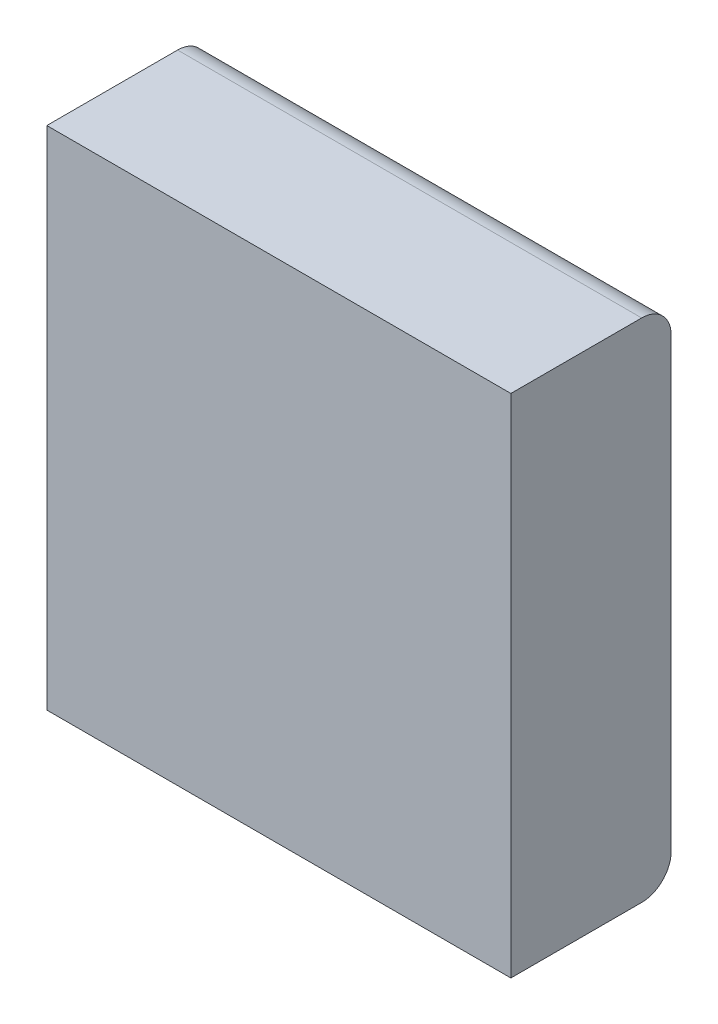
ISO-10303-21;
HEADER;
FILE_DESCRIPTION(('STEP AP214'),'2;1');
FILE_NAME('part.step','',(''),(''),'','','');
FILE_SCHEMA(('AUTOMOTIVE_DESIGN { 1 0 10303 214 1 1 1 1 }'));
ENDSEC;
DATA;
#1=APPLICATION_CONTEXT('core data for automotive mechanical design processes');
#2=APPLICATION_PROTOCOL_DEFINITION('international standard','automotive_design',2000,#1);
#3=PRODUCT_CONTEXT('',#1,'mechanical');
#4=PRODUCT('Part','Part','',(#3));
#5=PRODUCT_RELATED_PRODUCT_CATEGORY('part','',(#4));
#6=PRODUCT_DEFINITION_FORMATION('','',#4);
#7=PRODUCT_DEFINITION_CONTEXT('part definition',#1,'design');
#8=PRODUCT_DEFINITION('design','',#6,#7);
#9=PRODUCT_DEFINITION_SHAPE('','',#8);
#10=(LENGTH_UNIT() NAMED_UNIT(*) SI_UNIT(.MILLI.,.METRE.));
#11=(NAMED_UNIT(*) PLANE_ANGLE_UNIT() SI_UNIT($,.RADIAN.));
#12=(NAMED_UNIT(*) SI_UNIT($,.STERADIAN.) SOLID_ANGLE_UNIT());
#13=UNCERTAINTY_MEASURE_WITH_UNIT(LENGTH_MEASURE(1.E-05),#10,'distance_accuracy_value','');
#14=(GEOMETRIC_REPRESENTATION_CONTEXT(3) GLOBAL_UNCERTAINTY_ASSIGNED_CONTEXT((#13)) GLOBAL_UNIT_ASSIGNED_CONTEXT((#10,
#11,#12)) REPRESENTATION_CONTEXT('',''));
#15=CARTESIAN_POINT('',(0.,0.,0.));
#16=DIRECTION('',(0.,0.,1.));
#17=DIRECTION('',(1.,0.,0.));
#18=AXIS2_PLACEMENT_3D('',#15,#16,#17);
#19=CARTESIAN_POINT('',(-64.0530234910643,35.1607142857143,30.));
#20=DIRECTION('',(1.,0.,0.));
#21=DIRECTION('',(0.,1.,0.));
#22=AXIS2_PLACEMENT_3D('',#19,#20,#21);
#23=PLANE('',#22);
#24=DIRECTION('',(0.,0.,-1.));
#25=VECTOR('',#24,1.);
#26=CARTESIAN_POINT('',(-64.0530234910643,35.1607142857143,30.));
#27=LINE('',#26,#25);
#28=CARTESIAN_POINT('',(-64.0530234910643,35.1607142857143,30.));
#29=VERTEX_POINT('',#28);
#30=CARTESIAN_POINT('',(-64.0530234910644,35.1607142857143,-0.999999999999951));
#31=VERTEX_POINT('',#30);
#32=EDGE_CURVE('E182',#29,#31,#27,.T.);
#33=ORIENTED_EDGE('',*,*,#32,.T.);
#34=CARTESIAN_POINT('',(-64.0530234910644,28.1607142857143,-1.));
#35=DIRECTION('',(1.,0.,0.));
#36=DIRECTION('',(0.,-1.,0.));
#37=AXIS2_PLACEMENT_3D('',#34,#35,#36);
#38=CIRCLE('',#37,7.);
#39=CARTESIAN_POINT('',(-64.0530234910644,28.1607142857142,-8.));
#40=VERTEX_POINT('',#39);
#41=EDGE_CURVE('E155',#40,#31,#38,.T.);
#42=ORIENTED_EDGE('',*,*,#41,.F.);
#43=DIRECTION('',(0.,1.,0.));
#44=VECTOR('',#43,1.);
#45=CARTESIAN_POINT('',(-64.0530234910644,28.1607142857142,-8.));
#46=LINE('',#45,#44);
#47=CARTESIAN_POINT('',(-64.0530234910644,-77.8392857142857,-8.00000000000001));
#48=VERTEX_POINT('',#47);
#49=EDGE_CURVE('E151',#48,#40,#46,.T.);
#50=ORIENTED_EDGE('',*,*,#49,.F.);
#51=CARTESIAN_POINT('',(-64.0530234910644,-77.8392857142857,-1.00000000000001));
#52=DIRECTION('',(1.,0.,0.));
#53=DIRECTION('',(0.,1.,0.));
#54=AXIS2_PLACEMENT_3D('',#51,#52,#53);
#55=CIRCLE('',#54,7.);
#56=CARTESIAN_POINT('',(-64.0530234910644,-84.8392857142857,-0.999999999999966));
#57=VERTEX_POINT('',#56);
#58=EDGE_CURVE('E148',#57,#48,#55,.T.);
#59=ORIENTED_EDGE('',*,*,#58,.F.);
#60=DIRECTION('',(0.,0.,-1.));
#61=VECTOR('',#60,1.);
#62=CARTESIAN_POINT('',(-64.0530234910643,-84.8392857142857,30.));
#63=LINE('',#62,#61);
#64=CARTESIAN_POINT('',(-64.0530234910643,-84.8392857142857,30.));
#65=VERTEX_POINT('',#64);
#66=EDGE_CURVE('E11',#65,#57,#63,.T.);
#67=ORIENTED_EDGE('',*,*,#66,.F.);
#68=DIRECTION('',(0.,-1.,0.));
#69=VECTOR('',#68,1.);
#70=CARTESIAN_POINT('',(-64.0530234910643,35.1607142857143,30.));
#71=LINE('',#70,#69);
#72=EDGE_CURVE('E169',#29,#65,#71,.T.);
#73=ORIENTED_EDGE('',*,*,#72,.F.);
#74=EDGE_LOOP('',(#33,#42,#50,#59,#67,#73));
#75=FACE_BOUND('',#74,.T.);
#76=ADVANCED_FACE('F33',(#75),#23,.F.);
#77=CARTESIAN_POINT('',(-64.0530234910643,-84.8392857142857,30.));
#78=DIRECTION('',(0.,1.,0.));
#79=DIRECTION('',(0.,0.,1.));
#80=AXIS2_PLACEMENT_3D('',#77,#78,#79);
#81=PLANE('',#80);
#82=ORIENTED_EDGE('',*,*,#66,.T.);
#83=DIRECTION('',(1.,0.,0.));
#84=VECTOR('',#83,1.);
#85=CARTESIAN_POINT('',(-64.0530234910644,-84.8392857142857,-0.999999999999966));
#86=LINE('',#85,#84);
#87=CARTESIAN_POINT('',(45.9469765089357,-84.8392857142857,-0.999999999999966));
#88=VERTEX_POINT('',#87);
#89=EDGE_CURVE('E158',#57,#88,#86,.T.);
#90=ORIENTED_EDGE('',*,*,#89,.T.);
#91=DIRECTION('',(0.,0.,-1.));
#92=VECTOR('',#91,1.);
#93=CARTESIAN_POINT('',(45.9469765089357,-84.8392857142857,30.));
#94=LINE('',#93,#92);
#95=CARTESIAN_POINT('',(45.9469765089357,-84.8392857142857,30.));
#96=VERTEX_POINT('',#95);
#97=EDGE_CURVE('E40',#96,#88,#94,.T.);
#98=ORIENTED_EDGE('',*,*,#97,.F.);
#99=DIRECTION('',(1.,0.,0.));
#100=VECTOR('',#99,1.);
#101=CARTESIAN_POINT('',(-64.0530234910643,-84.8392857142857,30.));
#102=LINE('',#101,#100);
#103=EDGE_CURVE('E177',#65,#96,#102,.T.);
#104=ORIENTED_EDGE('',*,*,#103,.F.);
#105=EDGE_LOOP('',(#82,#90,#98,#104));
#106=FACE_BOUND('',#105,.T.);
#107=ADVANCED_FACE('F193',(#106),#81,.F.);
#108=CARTESIAN_POINT('',(45.9469765089356,35.1607142857143,30.));
#109=DIRECTION('',(-1.,0.,0.));
#110=DIRECTION('',(0.,-1.,0.));
#111=AXIS2_PLACEMENT_3D('',#108,#109,#110);
#112=PLANE('',#111);
#113=ORIENTED_EDGE('',*,*,#97,.T.);
#114=CARTESIAN_POINT('',(45.9469765089357,-77.8392857142857,-1.00000000000001));
#115=DIRECTION('',(1.,0.,0.));
#116=DIRECTION('',(0.,1.,0.));
#117=AXIS2_PLACEMENT_3D('',#114,#115,#116);
#118=CIRCLE('',#117,7.);
#119=CARTESIAN_POINT('',(45.9469765089357,-77.8392857142857,-8.00000000000001));
#120=VERTEX_POINT('',#119);
#121=EDGE_CURVE('E144',#88,#120,#118,.T.);
#122=ORIENTED_EDGE('',*,*,#121,.T.);
#123=DIRECTION('',(0.,1.,0.));
#124=VECTOR('',#123,1.);
#125=CARTESIAN_POINT('',(45.9469765089356,28.1607142857142,-8.));
#126=LINE('',#125,#124);
#127=CARTESIAN_POINT('',(45.9469765089356,28.1607142857142,-8.));
#128=VERTEX_POINT('',#127);
#129=EDGE_CURVE('E161',#120,#128,#126,.T.);
#130=ORIENTED_EDGE('',*,*,#129,.T.);
#131=CARTESIAN_POINT('',(45.9469765089356,28.1607142857143,-1.));
#132=DIRECTION('',(1.,0.,0.));
#133=DIRECTION('',(0.,-1.,0.));
#134=AXIS2_PLACEMENT_3D('',#131,#132,#133);
#135=CIRCLE('',#134,7.);
#136=CARTESIAN_POINT('',(45.9469765089356,35.1607142857143,-0.999999999999951));
#137=VERTEX_POINT('',#136);
#138=EDGE_CURVE('E152',#128,#137,#135,.T.);
#139=ORIENTED_EDGE('',*,*,#138,.T.);
#140=DIRECTION('',(0.,0.,-1.));
#141=VECTOR('',#140,1.);
#142=CARTESIAN_POINT('',(45.9469765089356,35.1607142857143,30.));
#143=LINE('',#142,#141);
#144=CARTESIAN_POINT('',(45.9469765089356,35.1607142857143,30.));
#145=VERTEX_POINT('',#144);
#146=EDGE_CURVE('E184',#145,#137,#143,.T.);
#147=ORIENTED_EDGE('',*,*,#146,.F.);
#148=DIRECTION('',(0.,1.,0.));
#149=VECTOR('',#148,1.);
#150=CARTESIAN_POINT('',(45.9469765089356,35.1607142857143,30.));
#151=LINE('',#150,#149);
#152=EDGE_CURVE('E179',#96,#145,#151,.T.);
#153=ORIENTED_EDGE('',*,*,#152,.F.);
#154=EDGE_LOOP('',(#113,#122,#130,#139,#147,#153));
#155=FACE_BOUND('',#154,.T.);
#156=ADVANCED_FACE('F188',(#155),#112,.F.);
#157=CARTESIAN_POINT('',(-64.0530234910643,35.1607142857143,30.));
#158=DIRECTION('',(0.,-1.,0.));
#159=DIRECTION('',(0.,0.,-1.));
#160=AXIS2_PLACEMENT_3D('',#157,#158,#159);
#161=PLANE('',#160);
#162=ORIENTED_EDGE('',*,*,#146,.T.);
#163=DIRECTION('',(1.,0.,0.));
#164=VECTOR('',#163,1.);
#165=CARTESIAN_POINT('',(-64.0530234910644,35.1607142857143,-0.999999999999951));
#166=LINE('',#165,#164);
#167=EDGE_CURVE('E166',#31,#137,#166,.T.);
#168=ORIENTED_EDGE('',*,*,#167,.F.);
#169=ORIENTED_EDGE('',*,*,#32,.F.);
#170=DIRECTION('',(-1.,0.,0.));
#171=VECTOR('',#170,1.);
#172=CARTESIAN_POINT('',(-64.0530234910643,35.1607142857143,30.));
#173=LINE('',#172,#171);
#174=EDGE_CURVE('E55',#145,#29,#173,.T.);
#175=ORIENTED_EDGE('',*,*,#174,.F.);
#176=EDGE_LOOP('',(#162,#168,#169,#175));
#177=FACE_BOUND('',#176,.T.);
#178=ADVANCED_FACE('F208',(#177),#161,.F.);
#179=CARTESIAN_POINT('',(0.,0.,30.));
#180=DIRECTION('',(0.,0.,1.));
#181=DIRECTION('',(1.,0.,0.));
#182=AXIS2_PLACEMENT_3D('',#179,#180,#181);
#183=PLANE('',#182);
#184=ORIENTED_EDGE('',*,*,#72,.T.);
#185=ORIENTED_EDGE('',*,*,#103,.T.);
#186=ORIENTED_EDGE('',*,*,#152,.T.);
#187=ORIENTED_EDGE('',*,*,#174,.T.);
#188=EDGE_LOOP('',(#184,#185,#186,#187));
#189=FACE_BOUND('',#188,.T.);
#190=ADVANCED_FACE('F211',(#189),#183,.T.);
#191=CARTESIAN_POINT('',(-64.0530234910644,28.1607142857143,-1.));
#192=DIRECTION('',(1.,0.,0.));
#193=DIRECTION('',(0.,1.,0.));
#194=AXIS2_PLACEMENT_3D('',#191,#192,#193);
#195=CYLINDRICAL_SURFACE('',#194,7.);
#196=ORIENTED_EDGE('',*,*,#138,.F.);
#197=DIRECTION('',(1.,0.,0.));
#198=VECTOR('',#197,1.);
#199=CARTESIAN_POINT('',(-64.0530234910644,28.1607142857142,-8.));
#200=LINE('',#199,#198);
#201=EDGE_CURVE('E170',#40,#128,#200,.T.);
#202=ORIENTED_EDGE('',*,*,#201,.F.);
#203=ORIENTED_EDGE('',*,*,#41,.T.);
#204=ORIENTED_EDGE('',*,*,#167,.T.);
#205=EDGE_LOOP('',(#196,#202,#203,#204));
#206=FACE_BOUND('',#205,.T.);
#207=ADVANCED_FACE('F204',(#206),#195,.T.);
#208=CARTESIAN_POINT('',(-64.0530234910644,28.1607142857142,-8.));
#209=DIRECTION('',(0.,0.,-1.));
#210=DIRECTION('',(0.,1.,0.));
#211=AXIS2_PLACEMENT_3D('',#208,#209,#210);
#212=PLANE('',#211);
#213=DIRECTION('',(0.,-1.,0.));
#214=VECTOR('',#213,1.);
#215=CARTESIAN_POINT('',(35.9469765089357,-54.8392857142857,-8.00000000000001));
#216=LINE('',#215,#214);
#217=CARTESIAN_POINT('',(35.9469765089357,5.16071428571427,-8.));
#218=VERTEX_POINT('',#217);
#219=CARTESIAN_POINT('',(35.9469765089357,-54.8392857142857,-8.00000000000001));
#220=VERTEX_POINT('',#219);
#221=EDGE_CURVE('E47',#218,#220,#216,.T.);
#222=ORIENTED_EDGE('',*,*,#221,.F.);
#223=DIRECTION('',(1.,0.,0.));
#224=VECTOR('',#223,1.);
#225=CARTESIAN_POINT('',(35.9469765089357,5.16071428571427,-8.));
#226=LINE('',#225,#224);
#227=CARTESIAN_POINT('',(-4.05302349106434,5.16071428571427,-8.));
#228=VERTEX_POINT('',#227);
#229=EDGE_CURVE('E129',#228,#218,#226,.T.);
#230=ORIENTED_EDGE('',*,*,#229,.F.);
#231=DIRECTION('',(0.,1.,0.));
#232=VECTOR('',#231,1.);
#233=CARTESIAN_POINT('',(-4.05302349106434,-54.8392857142857,-8.00000000000001));
#234=LINE('',#233,#232);
#235=CARTESIAN_POINT('',(-4.05302349106434,-54.8392857142857,-8.00000000000001));
#236=VERTEX_POINT('',#235);
#237=EDGE_CURVE('E132',#236,#228,#234,.T.);
#238=ORIENTED_EDGE('',*,*,#237,.F.);
#239=DIRECTION('',(-1.,0.,0.));
#240=VECTOR('',#239,1.);
#241=CARTESIAN_POINT('',(35.9469765089357,-54.8392857142857,-8.00000000000001));
#242=LINE('',#241,#240);
#243=EDGE_CURVE('E138',#220,#236,#242,.T.);
#244=ORIENTED_EDGE('',*,*,#243,.F.);
#245=EDGE_LOOP('',(#222,#230,#238,#244));
#246=FACE_BOUND('',#245,.T.);
#247=ORIENTED_EDGE('',*,*,#129,.F.);
#248=DIRECTION('',(1.,0.,0.));
#249=VECTOR('',#248,1.);
#250=CARTESIAN_POINT('',(-64.0530234910644,-77.8392857142857,-8.00000000000001));
#251=LINE('',#250,#249);
#252=EDGE_CURVE('E172',#48,#120,#251,.T.);
#253=ORIENTED_EDGE('',*,*,#252,.F.);
#254=ORIENTED_EDGE('',*,*,#49,.T.);
#255=ORIENTED_EDGE('',*,*,#201,.T.);
#256=EDGE_LOOP('',(#247,#253,#254,#255));
#257=FACE_BOUND('',#256,.T.);
#258=ADVANCED_FACE('F201',(#246,#257),#212,.T.);
#259=CARTESIAN_POINT('',(-64.0530234910644,-77.8392857142857,-1.00000000000001));
#260=DIRECTION('',(1.,0.,0.));
#261=DIRECTION('',(0.,1.,0.));
#262=AXIS2_PLACEMENT_3D('',#259,#260,#261);
#263=CYLINDRICAL_SURFACE('',#262,7.);
#264=ORIENTED_EDGE('',*,*,#121,.F.);
#265=ORIENTED_EDGE('',*,*,#89,.F.);
#266=ORIENTED_EDGE('',*,*,#58,.T.);
#267=ORIENTED_EDGE('',*,*,#252,.T.);
#268=EDGE_LOOP('',(#264,#265,#266,#267));
#269=FACE_BOUND('',#268,.T.);
#270=ADVANCED_FACE('F197',(#269),#263,.T.);
#271=CARTESIAN_POINT('',(35.9469765089357,-54.8392857142857,-5.00000000000006));
#272=DIRECTION('',(1.,0.,0.));
#273=DIRECTION('',(0.,0.,-1.));
#274=AXIS2_PLACEMENT_3D('',#271,#272,#273);
#275=PLANE('',#274);
#276=ORIENTED_EDGE('',*,*,#221,.T.);
#277=DIRECTION('',(0.,0.,-1.));
#278=VECTOR('',#277,1.);
#279=CARTESIAN_POINT('',(35.9469765089357,-54.8392857142857,-5.00000000000006));
#280=LINE('',#279,#278);
#281=CARTESIAN_POINT('',(35.9469765089357,-54.8392857142857,-5.00000000000006));
#282=VERTEX_POINT('',#281);
#283=EDGE_CURVE('E107',#282,#220,#280,.T.);
#284=ORIENTED_EDGE('',*,*,#283,.F.);
#285=DIRECTION('',(0.,-1.,0.));
#286=VECTOR('',#285,1.);
#287=CARTESIAN_POINT('',(35.9469765089357,-54.8392857142857,-5.00000000000006));
#288=LINE('',#287,#286);
#289=CARTESIAN_POINT('',(35.9469765089357,5.16071428571427,-5.00000000000005));
#290=VERTEX_POINT('',#289);
#291=EDGE_CURVE('E111',#290,#282,#288,.T.);
#292=ORIENTED_EDGE('',*,*,#291,.F.);
#293=DIRECTION('',(0.,0.,-1.));
#294=VECTOR('',#293,1.);
#295=CARTESIAN_POINT('',(35.9469765089357,5.16071428571427,-5.00000000000005));
#296=LINE('',#295,#294);
#297=EDGE_CURVE('E142',#290,#218,#296,.T.);
#298=ORIENTED_EDGE('',*,*,#297,.T.);
#299=EDGE_LOOP('',(#276,#284,#292,#298));
#300=FACE_BOUND('',#299,.T.);
#301=ADVANCED_FACE('F109',(#300),#275,.F.);
#302=CARTESIAN_POINT('',(35.9469765089357,5.16071428571427,-5.00000000000005));
#303=DIRECTION('',(0.,1.,0.));
#304=DIRECTION('',(0.,0.,1.));
#305=AXIS2_PLACEMENT_3D('',#302,#303,#304);
#306=PLANE('',#305);
#307=ORIENTED_EDGE('',*,*,#229,.T.);
#308=ORIENTED_EDGE('',*,*,#297,.F.);
#309=DIRECTION('',(1.,0.,0.));
#310=VECTOR('',#309,1.);
#311=CARTESIAN_POINT('',(35.9469765089357,5.16071428571427,-5.00000000000005));
#312=LINE('',#311,#310);
#313=CARTESIAN_POINT('',(-4.05302349106434,5.16071428571427,-5.00000000000005));
#314=VERTEX_POINT('',#313);
#315=EDGE_CURVE('E117',#314,#290,#312,.T.);
#316=ORIENTED_EDGE('',*,*,#315,.F.);
#317=DIRECTION('',(0.,0.,-1.));
#318=VECTOR('',#317,1.);
#319=CARTESIAN_POINT('',(-4.05302349106434,5.16071428571427,-5.00000000000005));
#320=LINE('',#319,#318);
#321=EDGE_CURVE('E145',#314,#228,#320,.T.);
#322=ORIENTED_EDGE('',*,*,#321,.T.);
#323=EDGE_LOOP('',(#307,#308,#316,#322));
#324=FACE_BOUND('',#323,.T.);
#325=ADVANCED_FACE('F267',(#324),#306,.F.);
#326=CARTESIAN_POINT('',(-4.05302349106434,-54.8392857142857,-5.00000000000006));
#327=DIRECTION('',(-1.,0.,0.));
#328=DIRECTION('',(0.,0.,1.));
#329=AXIS2_PLACEMENT_3D('',#326,#327,#328);
#330=PLANE('',#329);
#331=ORIENTED_EDGE('',*,*,#237,.T.);
#332=ORIENTED_EDGE('',*,*,#321,.F.);
#333=DIRECTION('',(0.,1.,0.));
#334=VECTOR('',#333,1.);
#335=CARTESIAN_POINT('',(-4.05302349106434,-54.8392857142857,-5.00000000000006));
#336=LINE('',#335,#334);
#337=CARTESIAN_POINT('',(-4.05302349106434,-54.8392857142857,-5.00000000000006));
#338=VERTEX_POINT('',#337);
#339=EDGE_CURVE('E125',#338,#314,#336,.T.);
#340=ORIENTED_EDGE('',*,*,#339,.F.);
#341=DIRECTION('',(0.,0.,-1.));
#342=VECTOR('',#341,1.);
#343=CARTESIAN_POINT('',(-4.05302349106434,-54.8392857142857,-5.00000000000006));
#344=LINE('',#343,#342);
#345=EDGE_CURVE('E116',#338,#236,#344,.T.);
#346=ORIENTED_EDGE('',*,*,#345,.T.);
#347=EDGE_LOOP('',(#331,#332,#340,#346));
#348=FACE_BOUND('',#347,.T.);
#349=ADVANCED_FACE('F276',(#348),#330,.F.);
#350=CARTESIAN_POINT('',(35.9469765089357,-54.8392857142857,-5.00000000000006));
#351=DIRECTION('',(0.,-1.,0.));
#352=DIRECTION('',(0.,0.,-1.));
#353=AXIS2_PLACEMENT_3D('',#350,#351,#352);
#354=PLANE('',#353);
#355=ORIENTED_EDGE('',*,*,#243,.T.);
#356=ORIENTED_EDGE('',*,*,#345,.F.);
#357=DIRECTION('',(-1.,0.,0.));
#358=VECTOR('',#357,1.);
#359=CARTESIAN_POINT('',(35.9469765089357,-54.8392857142857,-5.00000000000006));
#360=LINE('',#359,#358);
#361=EDGE_CURVE('E120',#282,#338,#360,.T.);
#362=ORIENTED_EDGE('',*,*,#361,.F.);
#363=ORIENTED_EDGE('',*,*,#283,.T.);
#364=EDGE_LOOP('',(#355,#356,#362,#363));
#365=FACE_BOUND('',#364,.T.);
#366=ADVANCED_FACE('F121',(#365),#354,.F.);
#367=CARTESIAN_POINT('',(0.,0.,-5.00000000000005));
#368=DIRECTION('',(0.,0.,1.));
#369=DIRECTION('',(0.,-1.,0.));
#370=AXIS2_PLACEMENT_3D('',#367,#368,#369);
#371=PLANE('',#370);
#372=ORIENTED_EDGE('',*,*,#291,.T.);
#373=ORIENTED_EDGE('',*,*,#361,.T.);
#374=ORIENTED_EDGE('',*,*,#339,.T.);
#375=ORIENTED_EDGE('',*,*,#315,.T.);
#376=EDGE_LOOP('',(#372,#373,#374,#375));
#377=FACE_BOUND('',#376,.T.);
#378=ADVANCED_FACE('F127',(#377),#371,.F.);
#379=CLOSED_SHELL('',(#76,#107,#156,#178,#190,#207,#258,#270,#301,#325,#349,#366,#378));
#380=MANIFOLD_SOLID_BREP('B2',#379);
#381=ADVANCED_BREP_SHAPE_REPRESENTATION('',(#18,#380),#14);
#382=SHAPE_DEFINITION_REPRESENTATION(#9,#381);
ENDSEC;
END-ISO-10303-21;
